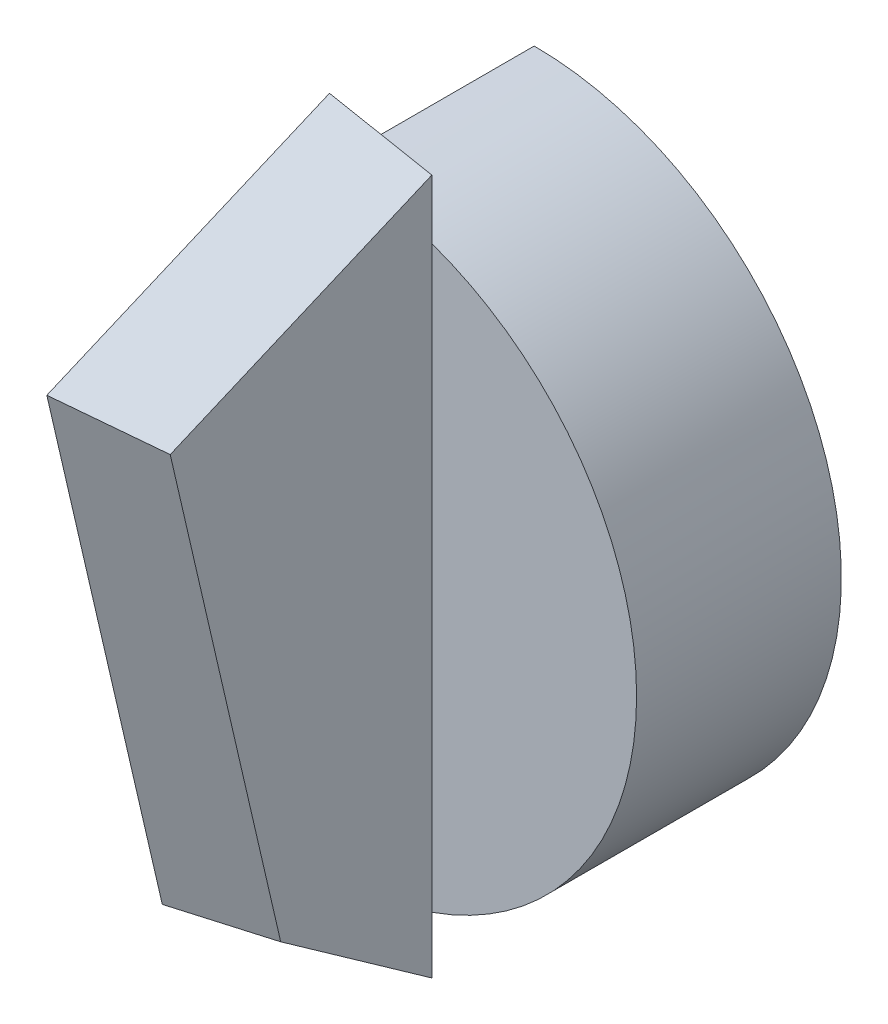
ISO-10303-21;
HEADER;
FILE_DESCRIPTION(('STEP AP214'),'2;1');
FILE_NAME('part.step','',(''),(''),'','','');
FILE_SCHEMA(('AUTOMOTIVE_DESIGN { 1 0 10303 214 1 1 1 1 }'));
ENDSEC;
DATA;
#1=APPLICATION_CONTEXT('core data for automotive mechanical design processes');
#2=APPLICATION_PROTOCOL_DEFINITION('international standard','automotive_design',2000,#1);
#3=PRODUCT_CONTEXT('',#1,'mechanical');
#4=PRODUCT('Part','Part','',(#3));
#5=PRODUCT_RELATED_PRODUCT_CATEGORY('part','',(#4));
#6=PRODUCT_DEFINITION_FORMATION('','',#4);
#7=PRODUCT_DEFINITION_CONTEXT('part definition',#1,'design');
#8=PRODUCT_DEFINITION('design','',#6,#7);
#9=PRODUCT_DEFINITION_SHAPE('','',#8);
#10=(LENGTH_UNIT() NAMED_UNIT(*) SI_UNIT(.MILLI.,.METRE.));
#11=(NAMED_UNIT(*) PLANE_ANGLE_UNIT() SI_UNIT($,.RADIAN.));
#12=(NAMED_UNIT(*) SI_UNIT($,.STERADIAN.) SOLID_ANGLE_UNIT());
#13=UNCERTAINTY_MEASURE_WITH_UNIT(LENGTH_MEASURE(1.E-05),#10,'distance_accuracy_value','');
#14=(GEOMETRIC_REPRESENTATION_CONTEXT(3) GLOBAL_UNCERTAINTY_ASSIGNED_CONTEXT((#13)) GLOBAL_UNIT_ASSIGNED_CONTEXT((#10,
#11,#12)) REPRESENTATION_CONTEXT('',''));
#15=CARTESIAN_POINT('',(0.,0.,0.));
#16=DIRECTION('',(0.,0.,1.));
#17=DIRECTION('',(1.,0.,0.));
#18=AXIS2_PLACEMENT_3D('',#15,#16,#17);
#19=CARTESIAN_POINT('',(0.,0.,10.));
#20=DIRECTION('',(0.,0.,-1.));
#21=DIRECTION('',(-1.,0.,0.));
#22=AXIS2_PLACEMENT_3D('',#19,#20,#21);
#23=CYLINDRICAL_SURFACE('',#22,15.);
#24=CARTESIAN_POINT('',(0.,0.,0.));
#25=DIRECTION('',(0.,0.,1.));
#26=DIRECTION('',(1.,0.,0.));
#27=AXIS2_PLACEMENT_3D('',#24,#25,#26);
#28=CIRCLE('',#27,15.);
#29=CARTESIAN_POINT('',(0.,-15.,0.));
#30=VERTEX_POINT('',#29);
#31=CARTESIAN_POINT('',(0.,15.,0.));
#32=VERTEX_POINT('',#31);
#33=EDGE_CURVE('E108',#30,#32,#28,.T.);
#34=ORIENTED_EDGE('',*,*,#33,.T.);
#35=DIRECTION('',(0.,0.,-1.));
#36=VECTOR('',#35,1.);
#37=CARTESIAN_POINT('',(0.,15.,10.));
#38=LINE('',#37,#36);
#39=CARTESIAN_POINT('',(0.,15.,10.));
#40=VERTEX_POINT('',#39);
#41=EDGE_CURVE('E48',#40,#32,#38,.T.);
#42=ORIENTED_EDGE('',*,*,#41,.F.);
#43=CARTESIAN_POINT('',(0.,0.,10.));
#44=DIRECTION('',(0.,0.,1.));
#45=DIRECTION('',(1.,0.,0.));
#46=AXIS2_PLACEMENT_3D('',#43,#44,#45);
#47=CIRCLE('',#46,15.);
#48=CARTESIAN_POINT('',(5.,14.142135623731,10.));
#49=VERTEX_POINT('',#48);
#50=EDGE_CURVE('E147',#49,#40,#47,.T.);
#51=ORIENTED_EDGE('',*,*,#50,.F.);
#52=CARTESIAN_POINT('',(5.,-14.142135623731,10.));
#53=VERTEX_POINT('',#52);
#54=EDGE_CURVE('E148',#53,#49,#47,.T.);
#55=ORIENTED_EDGE('',*,*,#54,.F.);
#56=CARTESIAN_POINT('',(0.,-15.,10.));
#57=VERTEX_POINT('',#56);
#58=EDGE_CURVE('E93',#57,#53,#47,.T.);
#59=ORIENTED_EDGE('',*,*,#58,.F.);
#60=DIRECTION('',(0.,0.,-1.));
#61=VECTOR('',#60,1.);
#62=CARTESIAN_POINT('',(0.,-15.,10.));
#63=LINE('',#62,#61);
#64=EDGE_CURVE('E151',#57,#30,#63,.T.);
#65=ORIENTED_EDGE('',*,*,#64,.T.);
#66=EDGE_LOOP('',(#34,#42,#51,#55,#59,#65));
#67=FACE_BOUND('',#66,.T.);
#68=ADVANCED_FACE('F38',(#67),#23,.T.);
#69=CARTESIAN_POINT('',(0.,15.,10.));
#70=DIRECTION('',(1.,0.,0.));
#71=DIRECTION('',(0.,0.,-1.));
#72=AXIS2_PLACEMENT_3D('',#69,#70,#71);
#73=PLANE('',#72);
#74=DIRECTION('',(0.,-1.,0.));
#75=VECTOR('',#74,1.);
#76=CARTESIAN_POINT('',(0.,15.,0.));
#77=LINE('',#76,#75);
#78=EDGE_CURVE('E111',#32,#30,#77,.T.);
#79=ORIENTED_EDGE('',*,*,#78,.T.);
#80=ORIENTED_EDGE('',*,*,#64,.F.);
#81=DIRECTION('',(0.,1.,0.));
#82=VECTOR('',#81,1.);
#83=CARTESIAN_POINT('',(0.,18.,10.));
#84=LINE('',#83,#82);
#85=CARTESIAN_POINT('',(0.,-18.,10.));
#86=VERTEX_POINT('',#85);
#87=EDGE_CURVE('E136',#86,#57,#84,.T.);
#88=ORIENTED_EDGE('',*,*,#87,.F.);
#89=DIRECTION('',(0.,0.577449814930285,0.81642618235636));
#90=VECTOR('',#89,1.);
#91=CARTESIAN_POINT('',(0.,-16.7123822813248,11.8204955499367));
#92=LINE('',#91,#90);
#93=CARTESIAN_POINT('',(0.,-12.2255018506971,18.1642618235636));
#94=VERTEX_POINT('',#93);
#95=EDGE_CURVE('E107',#94,#86,#92,.F.);
#96=ORIENTED_EDGE('',*,*,#95,.F.);
#97=DIRECTION('',(0.,0.974224463604135,0.225580793764088));
#98=VECTOR('',#97,1.);
#99=CARTESIAN_POINT('',(0.,-4.61400849621072,19.9266962283445));
#100=LINE('',#99,#98);
#101=CARTESIAN_POINT('',(0.,12.1301097394062,23.8037816676658));
#102=VERTEX_POINT('',#101);
#103=EDGE_CURVE('E104',#102,#94,#100,.F.);
#104=ORIENTED_EDGE('',*,*,#103,.F.);
#105=DIRECTION('',(0.,0.391326017372919,-0.92025211117772));
#106=VECTOR('',#105,1.);
#107=CARTESIAN_POINT('',(0.,18.8447370027489,8.01349520436106));
#108=LINE('',#107,#106);
#109=CARTESIAN_POINT('',(0.,18.,10.));
#110=VERTEX_POINT('',#109);
#111=EDGE_CURVE('E125',#110,#102,#108,.F.);
#112=ORIENTED_EDGE('',*,*,#111,.F.);
#113=EDGE_CURVE('E133',#40,#110,#84,.T.);
#114=ORIENTED_EDGE('',*,*,#113,.F.);
#115=ORIENTED_EDGE('',*,*,#41,.T.);
#116=EDGE_LOOP('',(#79,#80,#88,#96,#104,#112,#114,#115));
#117=FACE_BOUND('',#116,.T.);
#118=ADVANCED_FACE('F166',(#117),#73,.F.);
#119=CARTESIAN_POINT('',(0.,0.,10.));
#120=DIRECTION('',(0.,0.,1.));
#121=DIRECTION('',(1.,0.,0.));
#122=AXIS2_PLACEMENT_3D('',#119,#120,#121);
#123=PLANE('',#122);
#124=DIRECTION('',(0.,1.,0.));
#125=VECTOR('',#124,1.);
#126=CARTESIAN_POINT('',(5.,18.,10.));
#127=LINE('',#126,#125);
#128=EDGE_CURVE('E11',#53,#49,#127,.T.);
#129=ORIENTED_EDGE('',*,*,#128,.F.);
#130=ORIENTED_EDGE('',*,*,#54,.T.);
#131=EDGE_LOOP('',(#129,#130));
#132=FACE_BOUND('',#131,.T.);
#133=ADVANCED_FACE('F175',(#132),#123,.T.);
#134=CARTESIAN_POINT('',(0.,0.,0.));
#135=DIRECTION('',(0.,0.,1.));
#136=DIRECTION('',(1.,0.,0.));
#137=AXIS2_PLACEMENT_3D('',#134,#135,#136);
#138=PLANE('',#137);
#139=ORIENTED_EDGE('',*,*,#33,.F.);
#140=ORIENTED_EDGE('',*,*,#78,.F.);
#141=EDGE_LOOP('',(#139,#140));
#142=FACE_BOUND('',#141,.T.);
#143=ADVANCED_FACE('F172',(#142),#138,.F.);
#144=CARTESIAN_POINT('',(5.,18.,10.));
#145=DIRECTION('',(0.,0.,1.));
#146=DIRECTION('',(0.,-1.,0.));
#147=AXIS2_PLACEMENT_3D('',#144,#145,#146);
#148=PLANE('',#147);
#149=ORIENTED_EDGE('',*,*,#87,.T.);
#150=ORIENTED_EDGE('',*,*,#58,.T.);
#151=CARTESIAN_POINT('',(5.,-16.9201290666625,10.));
#152=VERTEX_POINT('',#151);
#153=EDGE_CURVE('E50',#152,#53,#127,.T.);
#154=ORIENTED_EDGE('',*,*,#153,.F.);
#155=DIRECTION('',(0.977463006147983,0.211106777750378,0.));
#156=VECTOR('',#155,1.);
#157=CARTESIAN_POINT('',(12.2057360034708,-15.3638760939722,10.));
#158=LINE('',#157,#156);
#159=EDGE_CURVE('E42',#152,#86,#158,.F.);
#160=ORIENTED_EDGE('',*,*,#159,.T.);
#161=EDGE_LOOP('',(#149,#150,#154,#160));
#162=FACE_BOUND('',#161,.T.);
#163=ADVANCED_FACE('F89',(#162),#148,.F.);
#164=CARTESIAN_POINT('',(5.,17.0419637262076,10.));
#165=VERTEX_POINT('',#164);
#166=EDGE_CURVE('E51',#49,#165,#127,.T.);
#167=ORIENTED_EDGE('',*,*,#166,.F.);
#168=ORIENTED_EDGE('',*,*,#50,.T.);
#169=ORIENTED_EDGE('',*,*,#113,.T.);
#170=DIRECTION('',(0.982133797856878,-0.188183960812884,0.));
#171=VECTOR('',#170,1.);
#172=CARTESIAN_POINT('',(-0.156125837136181,18.0299148430505,10.));
#173=LINE('',#172,#171);
#174=EDGE_CURVE('E109',#165,#110,#173,.F.);
#175=ORIENTED_EDGE('',*,*,#174,.F.);
#176=EDGE_LOOP('',(#167,#168,#169,#175));
#177=FACE_BOUND('',#176,.T.);
#178=ADVANCED_FACE('F178',(#177),#148,.F.);
#179=CARTESIAN_POINT('',(0.,-16.7123822813248,11.8204955499367));
#180=DIRECTION('',(0.173648177666931,-0.804022834146702,0.568677054718809));
#181=DIRECTION('',(0.,-0.577449814930285,-0.81642618235636));
#182=AXIS2_PLACEMENT_3D('',#179,#180,#181);
#183=PLANE('',#182);
#184=ORIENTED_EDGE('',*,*,#95,.T.);
#185=ORIENTED_EDGE('',*,*,#159,.F.);
#186=DIRECTION('',(0.,0.577449814930285,0.81642618235636));
#187=VECTOR('',#186,1.);
#188=CARTESIAN_POINT('',(5.,5.20262411831517,41.278207142908));
#189=LINE('',#188,#187);
#190=CARTESIAN_POINT('',(5.,-11.6995667215374,17.3810808748782));
#191=VERTEX_POINT('',#190);
#192=EDGE_CURVE('E97',#191,#152,#189,.F.);
#193=ORIENTED_EDGE('',*,*,#192,.F.);
#194=DIRECTION('',(-0.982661962733809,-0.103363289258156,0.153920425642193));
#195=VECTOR('',#194,1.);
#196=CARTESIAN_POINT('',(0.503768027948466,-12.172511990128,18.0853535191544));
#197=LINE('',#196,#195);
#198=EDGE_CURVE('E121',#191,#94,#197,.T.);
#199=ORIENTED_EDGE('',*,*,#198,.T.);
#200=EDGE_LOOP('',(#184,#185,#193,#199));
#201=FACE_BOUND('',#200,.T.);
#202=ADVANCED_FACE('F105',(#201),#183,.T.);
#203=CARTESIAN_POINT('',(0.,18.8447370027489,8.01349520436106));
#204=DIRECTION('',(0.173648177666931,0.906271413813671,0.385380895864241));
#205=DIRECTION('',(0.,-0.391326017372919,0.92025211117772));
#206=AXIS2_PLACEMENT_3D('',#203,#204,#205);
#207=PLANE('',#206);
#208=ORIENTED_EDGE('',*,*,#111,.T.);
#209=DIRECTION('',(-0.974517168416116,0.101706733035798,0.199930060064566));
#210=VECTOR('',#209,1.);
#211=CARTESIAN_POINT('',(2.41498557878419,11.8780666748947,23.3083278906881));
#212=LINE('',#211,#210);
#213=CARTESIAN_POINT('',(5.,11.6082783323664,22.7779913247952));
#214=VERTEX_POINT('',#213);
#215=EDGE_CURVE('E114',#214,#102,#212,.T.);
#216=ORIENTED_EDGE('',*,*,#215,.F.);
#217=DIRECTION('',(0.,0.391326017372919,-0.92025211117772));
#218=VECTOR('',#217,1.);
#219=CARTESIAN_POINT('',(5.,3.67150791851119,41.4423003792144));
#220=LINE('',#219,#218);
#221=EDGE_CURVE('E95',#165,#214,#220,.F.);
#222=ORIENTED_EDGE('',*,*,#221,.F.);
#223=ORIENTED_EDGE('',*,*,#174,.T.);
#224=EDGE_LOOP('',(#208,#216,#222,#223));
#225=FACE_BOUND('',#224,.T.);
#226=ADVANCED_FACE('F40',(#225),#207,.T.);
#227=CARTESIAN_POINT('',(0.,-4.61400849621072,19.9266962283445));
#228=DIRECTION('',(0.173648177666931,-0.222153714629522,0.959423804931512));
#229=DIRECTION('',(0.,-0.974224463604135,-0.225580793764088));
#230=AXIS2_PLACEMENT_3D('',#227,#228,#229);
#231=PLANE('',#230);
#232=ORIENTED_EDGE('',*,*,#103,.T.);
#233=ORIENTED_EDGE('',*,*,#198,.F.);
#234=DIRECTION('',(0.,0.974224463604135,0.225580793764088));
#235=VECTOR('',#234,1.);
#236=CARTESIAN_POINT('',(5.,9.02303210560825,22.1793798982763));
#237=LINE('',#236,#235);
#238=EDGE_CURVE('E100',#214,#191,#237,.F.);
#239=ORIENTED_EDGE('',*,*,#238,.F.);
#240=ORIENTED_EDGE('',*,*,#215,.T.);
#241=EDGE_LOOP('',(#232,#233,#239,#240));
#242=FACE_BOUND('',#241,.T.);
#243=ADVANCED_FACE('F179',(#242),#231,.T.);
#244=CARTESIAN_POINT('',(5.,4.48283429978399,41.7873070547946));
#245=DIRECTION('',(-1.,0.,0.));
#246=DIRECTION('',(0.,0.,1.));
#247=AXIS2_PLACEMENT_3D('',#244,#245,#246);
#248=PLANE('',#247);
#249=ORIENTED_EDGE('',*,*,#192,.T.);
#250=ORIENTED_EDGE('',*,*,#153,.T.);
#251=ORIENTED_EDGE('',*,*,#128,.T.);
#252=ORIENTED_EDGE('',*,*,#166,.T.);
#253=ORIENTED_EDGE('',*,*,#221,.T.);
#254=ORIENTED_EDGE('',*,*,#238,.T.);
#255=EDGE_LOOP('',(#249,#250,#251,#252,#253,#254));
#256=FACE_BOUND('',#255,.T.);
#257=ADVANCED_FACE('F98',(#256),#248,.F.);
#258=CLOSED_SHELL('',(#68,#118,#133,#143,#163,#178,#202,#226,#243,#257));
#259=MANIFOLD_SOLID_BREP('B2',#258);
#260=ADVANCED_BREP_SHAPE_REPRESENTATION('',(#18,#259),#14);
#261=SHAPE_DEFINITION_REPRESENTATION(#9,#260);
ENDSEC;
END-ISO-10303-21;
